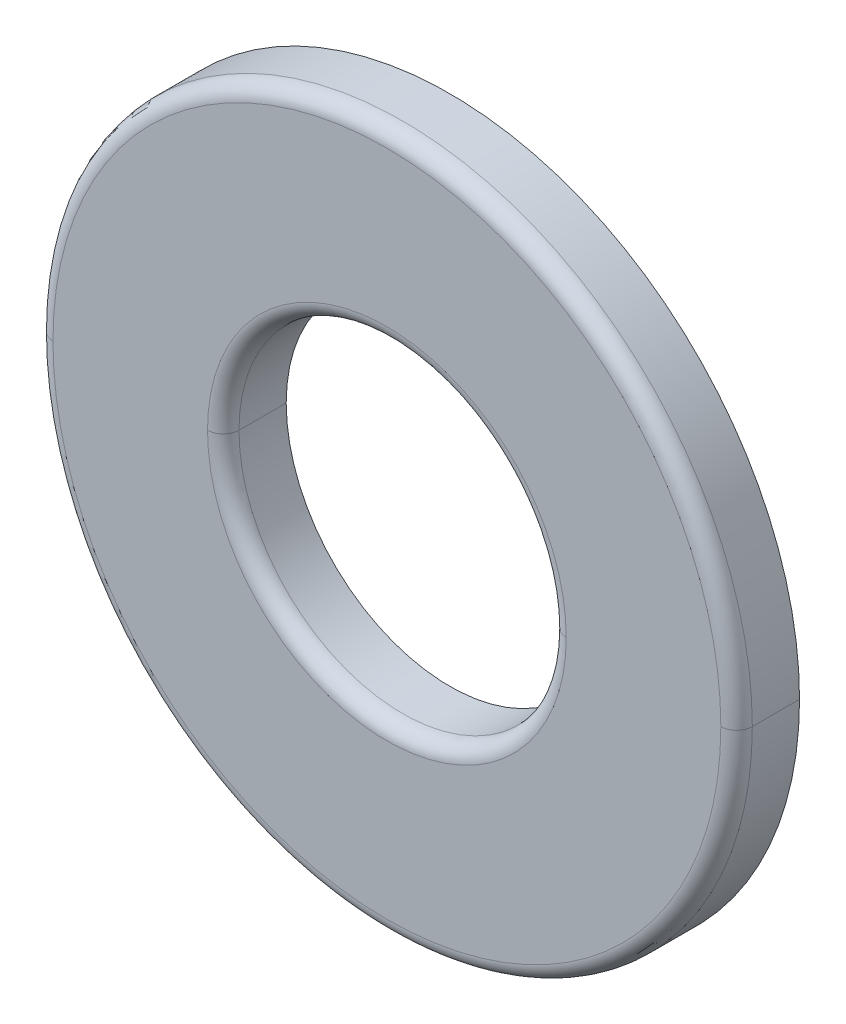
ISO-10303-21;
HEADER;
FILE_DESCRIPTION(('STEP AP214'),'2;1');
FILE_NAME('part.step','',(''),(''),'','','');
FILE_SCHEMA(('AUTOMOTIVE_DESIGN { 1 0 10303 214 1 1 1 1 }'));
ENDSEC;
DATA;
#1=APPLICATION_CONTEXT('core data for automotive mechanical design processes');
#2=APPLICATION_PROTOCOL_DEFINITION('international standard','automotive_design',2000,#1);
#3=PRODUCT_CONTEXT('',#1,'mechanical');
#4=PRODUCT('Part','Part','',(#3));
#5=PRODUCT_RELATED_PRODUCT_CATEGORY('part','',(#4));
#6=PRODUCT_DEFINITION_FORMATION('','',#4);
#7=PRODUCT_DEFINITION_CONTEXT('part definition',#1,'design');
#8=PRODUCT_DEFINITION('design','',#6,#7);
#9=PRODUCT_DEFINITION_SHAPE('','',#8);
#10=(LENGTH_UNIT() NAMED_UNIT(*) SI_UNIT(.MILLI.,.METRE.));
#11=(NAMED_UNIT(*) PLANE_ANGLE_UNIT() SI_UNIT($,.RADIAN.));
#12=(NAMED_UNIT(*) SI_UNIT($,.STERADIAN.) SOLID_ANGLE_UNIT());
#13=UNCERTAINTY_MEASURE_WITH_UNIT(LENGTH_MEASURE(1.E-05),#10,'distance_accuracy_value','');
#14=(GEOMETRIC_REPRESENTATION_CONTEXT(3) GLOBAL_UNCERTAINTY_ASSIGNED_CONTEXT((#13)) GLOBAL_UNIT_ASSIGNED_CONTEXT((#10,
#11,#12)) REPRESENTATION_CONTEXT('',''));
#15=CARTESIAN_POINT('',(0.,0.,0.));
#16=DIRECTION('',(0.,0.,1.));
#17=DIRECTION('',(1.,0.,0.));
#18=AXIS2_PLACEMENT_3D('',#15,#16,#17);
#19=CARTESIAN_POINT('',(0.,0.,0.28575));
#20=DIRECTION('',(0.,0.,1.));
#21=DIRECTION('',(1.,0.,0.));
#22=AXIS2_PLACEMENT_3D('',#19,#20,#21);
#23=TOROIDAL_SURFACE('',#22,3.25755,0.28575);
#24=CARTESIAN_POINT('',(-3.25755,0.,0.28575));
#25=DIRECTION('',(0.,1.,0.));
#26=DIRECTION('',(-1.,0.,0.));
#27=AXIS2_PLACEMENT_3D('',#24,#25,#26);
#28=CIRCLE('',#27,0.28575);
#29=CARTESIAN_POINT('',(-3.25755,0.,0.5715));
#30=VERTEX_POINT('',#29);
#31=CARTESIAN_POINT('',(-2.9718,0.,0.28575));
#32=VERTEX_POINT('',#31);
#33=EDGE_CURVE('E101',#30,#32,#28,.T.);
#34=ORIENTED_EDGE('',*,*,#33,.F.);
#35=CARTESIAN_POINT('',(0.,0.,0.5715));
#36=DIRECTION('',(0.,0.,-1.));
#37=DIRECTION('',(1.,0.,0.));
#38=AXIS2_PLACEMENT_3D('',#35,#36,#37);
#39=CIRCLE('',#38,3.25755);
#40=CARTESIAN_POINT('',(3.25755,0.,0.5715));
#41=VERTEX_POINT('',#40);
#42=EDGE_CURVE('E86',#41,#30,#39,.T.);
#43=ORIENTED_EDGE('',*,*,#42,.F.);
#44=CARTESIAN_POINT('',(3.25755,0.,0.28575));
#45=DIRECTION('',(0.,-1.,0.));
#46=DIRECTION('',(0.,0.,-1.));
#47=AXIS2_PLACEMENT_3D('',#44,#45,#46);
#48=CIRCLE('',#47,0.28575);
#49=CARTESIAN_POINT('',(2.9718,0.,0.28575));
#50=VERTEX_POINT('',#49);
#51=EDGE_CURVE('E111',#41,#50,#48,.T.);
#52=ORIENTED_EDGE('',*,*,#51,.T.);
#53=CARTESIAN_POINT('',(0.,0.,0.28575));
#54=DIRECTION('',(0.,0.,1.));
#55=DIRECTION('',(1.,0.,0.));
#56=AXIS2_PLACEMENT_3D('',#53,#54,#55);
#57=CIRCLE('',#56,2.9718);
#58=EDGE_CURVE('E103',#32,#50,#57,.T.);
#59=ORIENTED_EDGE('',*,*,#58,.F.);
#60=EDGE_LOOP('',(#34,#43,#52,#59));
#61=FACE_BOUND('',#60,.T.);
#62=ADVANCED_FACE('F16',(#61),#23,.T.);
#63=CARTESIAN_POINT('',(0.,0.,0.28575));
#64=DIRECTION('',(0.,0.,1.));
#65=DIRECTION('',(1.,0.,0.));
#66=AXIS2_PLACEMENT_3D('',#63,#64,#65);
#67=TOROIDAL_SURFACE('',#66,6.06425,0.28575);
#68=CARTESIAN_POINT('',(-6.06425,0.,0.28575));
#69=DIRECTION('',(0.,1.,0.));
#70=DIRECTION('',(-1.,0.,0.));
#71=AXIS2_PLACEMENT_3D('',#68,#69,#70);
#72=CIRCLE('',#71,0.28575);
#73=CARTESIAN_POINT('',(-6.35,0.,0.28575));
#74=VERTEX_POINT('',#73);
#75=CARTESIAN_POINT('',(-6.06425,0.,0.5715));
#76=VERTEX_POINT('',#75);
#77=EDGE_CURVE('E139',#74,#76,#72,.T.);
#78=ORIENTED_EDGE('',*,*,#77,.F.);
#79=CARTESIAN_POINT('',(0.,0.,0.28575));
#80=DIRECTION('',(0.,0.,-1.));
#81=DIRECTION('',(1.,0.,0.));
#82=AXIS2_PLACEMENT_3D('',#79,#80,#81);
#83=CIRCLE('',#82,6.35);
#84=CARTESIAN_POINT('',(6.35,0.,0.28575));
#85=VERTEX_POINT('',#84);
#86=EDGE_CURVE('E96',#85,#74,#83,.T.);
#87=ORIENTED_EDGE('',*,*,#86,.F.);
#88=CARTESIAN_POINT('',(6.06425,0.,0.28575));
#89=DIRECTION('',(0.,-1.,0.));
#90=DIRECTION('',(0.,0.,-1.));
#91=AXIS2_PLACEMENT_3D('',#88,#89,#90);
#92=CIRCLE('',#91,0.28575);
#93=CARTESIAN_POINT('',(6.06425,0.,0.5715));
#94=VERTEX_POINT('',#93);
#95=EDGE_CURVE('E150',#85,#94,#92,.T.);
#96=ORIENTED_EDGE('',*,*,#95,.T.);
#97=CARTESIAN_POINT('',(0.,0.,0.5715));
#98=DIRECTION('',(0.,0.,1.));
#99=DIRECTION('',(1.,0.,0.));
#100=AXIS2_PLACEMENT_3D('',#97,#98,#99);
#101=CIRCLE('',#100,6.06425);
#102=EDGE_CURVE('E97',#76,#94,#101,.T.);
#103=ORIENTED_EDGE('',*,*,#102,.F.);
#104=EDGE_LOOP('',(#78,#87,#96,#103));
#105=FACE_BOUND('',#104,.T.);
#106=ADVANCED_FACE('F177',(#105),#67,.T.);
#107=CARTESIAN_POINT('',(0.,0.,-0.5715));
#108=DIRECTION('',(0.,0.,1.));
#109=DIRECTION('',(1.,0.,0.));
#110=AXIS2_PLACEMENT_3D('',#107,#108,#109);
#111=PLANE('',#110);
#112=CARTESIAN_POINT('',(0.,0.,-0.5715));
#113=DIRECTION('',(0.,0.,1.));
#114=DIRECTION('',(1.,0.,0.));
#115=AXIS2_PLACEMENT_3D('',#112,#113,#114);
#116=CIRCLE('',#115,2.9718);
#117=CARTESIAN_POINT('',(-2.9718,0.,-0.5715));
#118=VERTEX_POINT('',#117);
#119=CARTESIAN_POINT('',(2.9718,0.,-0.5715));
#120=VERTEX_POINT('',#119);
#121=EDGE_CURVE('E130',#118,#120,#116,.T.);
#122=ORIENTED_EDGE('',*,*,#121,.T.);
#123=CARTESIAN_POINT('',(0.,0.,-0.5715));
#124=DIRECTION('',(0.,0.,1.));
#125=DIRECTION('',(1.,0.,0.));
#126=AXIS2_PLACEMENT_3D('',#123,#124,#125);
#127=CIRCLE('',#126,2.9718);
#128=EDGE_CURVE('E10',#120,#118,#127,.T.);
#129=ORIENTED_EDGE('',*,*,#128,.T.);
#130=EDGE_LOOP('',(#122,#129));
#131=FACE_BOUND('',#130,.T.);
#132=CARTESIAN_POINT('',(0.,0.,-0.5715));
#133=DIRECTION('',(0.,0.,1.));
#134=DIRECTION('',(1.,0.,0.));
#135=AXIS2_PLACEMENT_3D('',#132,#133,#134);
#136=CIRCLE('',#135,6.35);
#137=CARTESIAN_POINT('',(-6.35,0.,-0.5715));
#138=VERTEX_POINT('',#137);
#139=CARTESIAN_POINT('',(6.35,0.,-0.5715));
#140=VERTEX_POINT('',#139);
#141=EDGE_CURVE('E20',#138,#140,#136,.T.);
#142=ORIENTED_EDGE('',*,*,#141,.F.);
#143=CARTESIAN_POINT('',(0.,0.,-0.5715));
#144=DIRECTION('',(0.,0.,1.));
#145=DIRECTION('',(1.,0.,0.));
#146=AXIS2_PLACEMENT_3D('',#143,#144,#145);
#147=CIRCLE('',#146,6.35);
#148=EDGE_CURVE('E135',#140,#138,#147,.T.);
#149=ORIENTED_EDGE('',*,*,#148,.F.);
#150=EDGE_LOOP('',(#142,#149));
#151=FACE_BOUND('',#150,.T.);
#152=ADVANCED_FACE('F201',(#131,#151),#111,.F.);
#153=CARTESIAN_POINT('',(0.,0.,0.5715));
#154=DIRECTION('',(0.,0.,-1.));
#155=DIRECTION('',(-1.,0.,0.));
#156=AXIS2_PLACEMENT_3D('',#153,#154,#155);
#157=CYLINDRICAL_SURFACE('',#156,2.9718);
#158=DIRECTION('',(0.,0.,-1.));
#159=VECTOR('',#158,1.);
#160=CARTESIAN_POINT('',(2.9718,0.,0.5715));
#161=LINE('',#160,#159);
#162=EDGE_CURVE('E126',#50,#120,#161,.T.);
#163=ORIENTED_EDGE('',*,*,#162,.F.);
#164=CARTESIAN_POINT('',(0.,0.,0.28575));
#165=DIRECTION('',(0.,0.,1.));
#166=DIRECTION('',(1.,0.,0.));
#167=AXIS2_PLACEMENT_3D('',#164,#165,#166);
#168=CIRCLE('',#167,2.9718);
#169=EDGE_CURVE('E108',#50,#32,#168,.T.);
#170=ORIENTED_EDGE('',*,*,#169,.T.);
#171=DIRECTION('',(0.,0.,-1.));
#172=VECTOR('',#171,1.);
#173=CARTESIAN_POINT('',(-2.9718,0.,0.5715));
#174=LINE('',#173,#172);
#175=EDGE_CURVE('E136',#32,#118,#174,.T.);
#176=ORIENTED_EDGE('',*,*,#175,.T.);
#177=ORIENTED_EDGE('',*,*,#128,.F.);
#178=EDGE_LOOP('',(#163,#170,#176,#177));
#179=FACE_BOUND('',#178,.T.);
#180=ADVANCED_FACE('F196',(#179),#157,.F.);
#181=CARTESIAN_POINT('',(0.,0.,0.5715));
#182=DIRECTION('',(0.,0.,-1.));
#183=DIRECTION('',(-1.,0.,0.));
#184=AXIS2_PLACEMENT_3D('',#181,#182,#183);
#185=CYLINDRICAL_SURFACE('',#184,6.35);
#186=DIRECTION('',(0.,0.,-1.));
#187=VECTOR('',#186,1.);
#188=CARTESIAN_POINT('',(6.35,0.,0.5715));
#189=LINE('',#188,#187);
#190=EDGE_CURVE('E131',#85,#140,#189,.T.);
#191=ORIENTED_EDGE('',*,*,#190,.F.);
#192=ORIENTED_EDGE('',*,*,#86,.T.);
#193=DIRECTION('',(0.,0.,-1.));
#194=VECTOR('',#193,1.);
#195=CARTESIAN_POINT('',(-6.35,0.,0.5715));
#196=LINE('',#195,#194);
#197=EDGE_CURVE('E123',#74,#138,#196,.T.);
#198=ORIENTED_EDGE('',*,*,#197,.T.);
#199=ORIENTED_EDGE('',*,*,#141,.T.);
#200=EDGE_LOOP('',(#191,#192,#198,#199));
#201=FACE_BOUND('',#200,.T.);
#202=ADVANCED_FACE('F18',(#201),#185,.T.);
#203=CARTESIAN_POINT('',(0.,0.,0.5715));
#204=DIRECTION('',(0.,0.,1.));
#205=DIRECTION('',(1.,0.,0.));
#206=AXIS2_PLACEMENT_3D('',#203,#204,#205);
#207=PLANE('',#206);
#208=ORIENTED_EDGE('',*,*,#42,.T.);
#209=CARTESIAN_POINT('',(0.,0.,0.5715));
#210=DIRECTION('',(0.,0.,-1.));
#211=DIRECTION('',(1.,0.,0.));
#212=AXIS2_PLACEMENT_3D('',#209,#210,#211);
#213=CIRCLE('',#212,3.25755);
#214=EDGE_CURVE('E91',#30,#41,#213,.T.);
#215=ORIENTED_EDGE('',*,*,#214,.T.);
#216=EDGE_LOOP('',(#208,#215));
#217=FACE_BOUND('',#216,.T.);
#218=CARTESIAN_POINT('',(0.,0.,0.5715));
#219=DIRECTION('',(0.,0.,1.));
#220=DIRECTION('',(1.,0.,0.));
#221=AXIS2_PLACEMENT_3D('',#218,#219,#220);
#222=CIRCLE('',#221,6.06425);
#223=EDGE_CURVE('E143',#94,#76,#222,.T.);
#224=ORIENTED_EDGE('',*,*,#223,.T.);
#225=ORIENTED_EDGE('',*,*,#102,.T.);
#226=EDGE_LOOP('',(#224,#225));
#227=FACE_BOUND('',#226,.T.);
#228=ADVANCED_FACE('F88',(#217,#227),#207,.T.);
#229=CARTESIAN_POINT('',(0.,0.,0.5715));
#230=DIRECTION('',(0.,0.,-1.));
#231=DIRECTION('',(-1.,0.,0.));
#232=AXIS2_PLACEMENT_3D('',#229,#230,#231);
#233=CYLINDRICAL_SURFACE('',#232,6.35);
#234=CARTESIAN_POINT('',(0.,0.,0.28575));
#235=DIRECTION('',(0.,0.,-1.));
#236=DIRECTION('',(1.,0.,0.));
#237=AXIS2_PLACEMENT_3D('',#234,#235,#236);
#238=CIRCLE('',#237,6.35);
#239=EDGE_CURVE('E118',#74,#85,#238,.T.);
#240=ORIENTED_EDGE('',*,*,#239,.T.);
#241=ORIENTED_EDGE('',*,*,#190,.T.);
#242=ORIENTED_EDGE('',*,*,#148,.T.);
#243=ORIENTED_EDGE('',*,*,#197,.F.);
#244=EDGE_LOOP('',(#240,#241,#242,#243));
#245=FACE_BOUND('',#244,.T.);
#246=ADVANCED_FACE('F233',(#245),#233,.T.);
#247=CARTESIAN_POINT('',(0.,0.,0.5715));
#248=DIRECTION('',(0.,0.,-1.));
#249=DIRECTION('',(-1.,0.,0.));
#250=AXIS2_PLACEMENT_3D('',#247,#248,#249);
#251=CYLINDRICAL_SURFACE('',#250,2.9718);
#252=ORIENTED_EDGE('',*,*,#58,.T.);
#253=ORIENTED_EDGE('',*,*,#162,.T.);
#254=ORIENTED_EDGE('',*,*,#121,.F.);
#255=ORIENTED_EDGE('',*,*,#175,.F.);
#256=EDGE_LOOP('',(#252,#253,#254,#255));
#257=FACE_BOUND('',#256,.T.);
#258=ADVANCED_FACE('F213',(#257),#251,.F.);
#259=CARTESIAN_POINT('',(0.,0.,0.28575));
#260=DIRECTION('',(0.,0.,1.));
#261=DIRECTION('',(1.,0.,0.));
#262=AXIS2_PLACEMENT_3D('',#259,#260,#261);
#263=TOROIDAL_SURFACE('',#262,6.06425,0.28575);
#264=ORIENTED_EDGE('',*,*,#239,.F.);
#265=ORIENTED_EDGE('',*,*,#77,.T.);
#266=ORIENTED_EDGE('',*,*,#223,.F.);
#267=ORIENTED_EDGE('',*,*,#95,.F.);
#268=EDGE_LOOP('',(#264,#265,#266,#267));
#269=FACE_BOUND('',#268,.T.);
#270=ADVANCED_FACE('F189',(#269),#263,.T.);
#271=CARTESIAN_POINT('',(0.,0.,0.28575));
#272=DIRECTION('',(0.,0.,1.));
#273=DIRECTION('',(1.,0.,0.));
#274=AXIS2_PLACEMENT_3D('',#271,#272,#273);
#275=TOROIDAL_SURFACE('',#274,3.25755,0.28575);
#276=ORIENTED_EDGE('',*,*,#214,.F.);
#277=ORIENTED_EDGE('',*,*,#33,.T.);
#278=ORIENTED_EDGE('',*,*,#169,.F.);
#279=ORIENTED_EDGE('',*,*,#51,.F.);
#280=EDGE_LOOP('',(#276,#277,#278,#279));
#281=FACE_BOUND('',#280,.T.);
#282=ADVANCED_FACE('F110',(#281),#275,.T.);
#283=CLOSED_SHELL('',(#62,#106,#152,#180,#202,#228,#246,#258,#270,#282));
#284=MANIFOLD_SOLID_BREP('B1',#283);
#285=ADVANCED_BREP_SHAPE_REPRESENTATION('',(#18,#284),#14);
#286=SHAPE_DEFINITION_REPRESENTATION(#9,#285);
ENDSEC;
END-ISO-10303-21;
